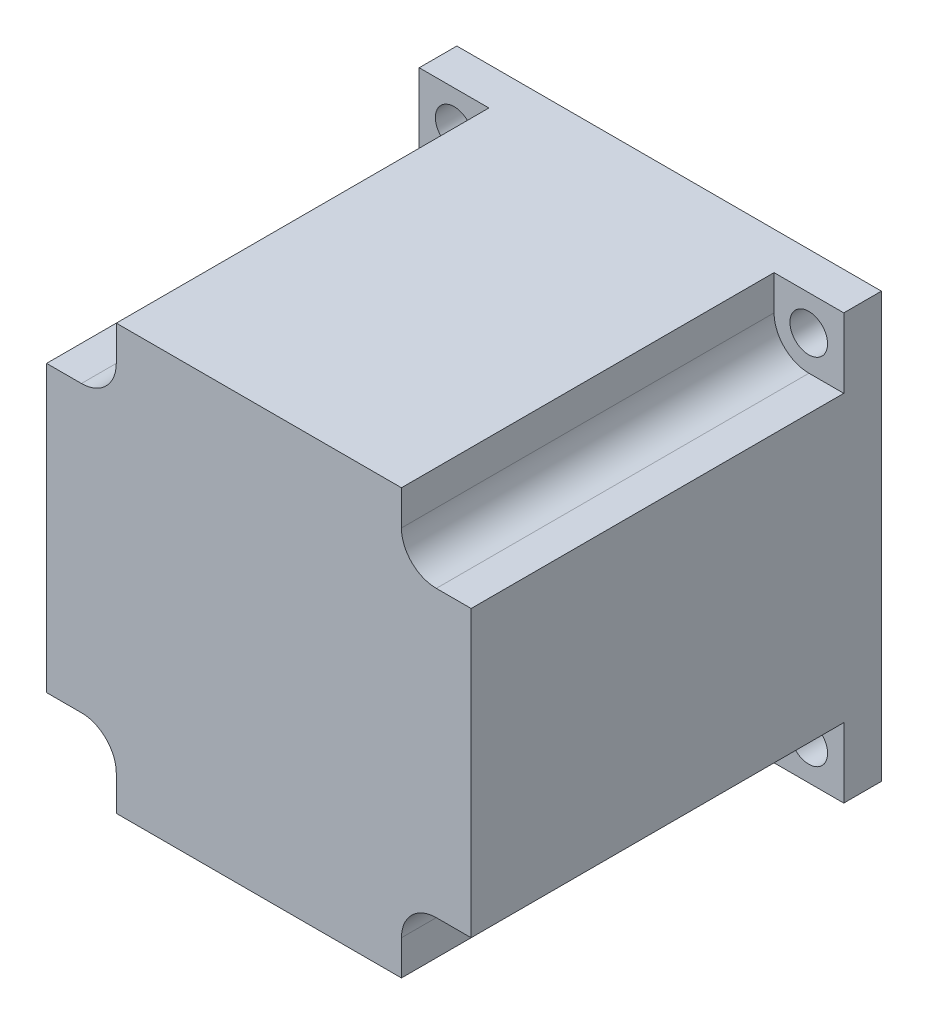
ISO-10303-21;
HEADER;
FILE_DESCRIPTION(('STEP AP214'),'2;1');
FILE_NAME('part.step','',(''),(''),'','','');
FILE_SCHEMA(('AUTOMOTIVE_DESIGN { 1 0 10303 214 1 1 1 1 }'));
ENDSEC;
DATA;
#1=APPLICATION_CONTEXT('core data for automotive mechanical design processes');
#2=APPLICATION_PROTOCOL_DEFINITION('international standard','automotive_design',2000,#1);
#3=PRODUCT_CONTEXT('',#1,'mechanical');
#4=PRODUCT('Part','Part','',(#3));
#5=PRODUCT_RELATED_PRODUCT_CATEGORY('part','',(#4));
#6=PRODUCT_DEFINITION_FORMATION('','',#4);
#7=PRODUCT_DEFINITION_CONTEXT('part definition',#1,'design');
#8=PRODUCT_DEFINITION('design','',#6,#7);
#9=PRODUCT_DEFINITION_SHAPE('','',#8);
#10=(LENGTH_UNIT() NAMED_UNIT(*) SI_UNIT(.MILLI.,.METRE.));
#11=(NAMED_UNIT(*) PLANE_ANGLE_UNIT() SI_UNIT($,.RADIAN.));
#12=(NAMED_UNIT(*) SI_UNIT($,.STERADIAN.) SOLID_ANGLE_UNIT());
#13=UNCERTAINTY_MEASURE_WITH_UNIT(LENGTH_MEASURE(1.E-05),#10,'distance_accuracy_value','');
#14=(GEOMETRIC_REPRESENTATION_CONTEXT(3) GLOBAL_UNCERTAINTY_ASSIGNED_CONTEXT((#13)) GLOBAL_UNIT_ASSIGNED_CONTEXT((#10,
#11,#12)) REPRESENTATION_CONTEXT('',''));
#15=CARTESIAN_POINT('',(0.,0.,0.));
#16=DIRECTION('',(0.,0.,1.));
#17=DIRECTION('',(1.,0.,0.));
#18=AXIS2_PLACEMENT_3D('',#15,#16,#17);
#19=CARTESIAN_POINT('',(23.55,-23.55,54.5));
#20=DIRECTION('',(0.,0.,-1.));
#21=DIRECTION('',(-1.,0.,0.));
#22=AXIS2_PLACEMENT_3D('',#19,#20,#21);
#23=CYLINDRICAL_SURFACE('',#22,2.5);
#24=CARTESIAN_POINT('',(23.55,-23.55,0.));
#25=DIRECTION('',(0.,0.,1.));
#26=DIRECTION('',(1.,0.,0.));
#27=AXIS2_PLACEMENT_3D('',#24,#25,#26);
#28=CIRCLE('',#27,2.5);
#29=CARTESIAN_POINT('',(26.05,-23.55,0.));
#30=VERTEX_POINT('',#29);
#31=EDGE_CURVE('E345',#30,#30,#28,.T.);
#32=ORIENTED_EDGE('',*,*,#31,.F.);
#33=EDGE_LOOP('',(#32));
#34=FACE_BOUND('',#33,.T.);
#35=CARTESIAN_POINT('',(23.55,-23.55,5.));
#36=DIRECTION('',(0.,0.,1.));
#37=DIRECTION('',(1.,0.,0.));
#38=AXIS2_PLACEMENT_3D('',#35,#36,#37);
#39=CIRCLE('',#38,2.5);
#40=CARTESIAN_POINT('',(26.05,-23.55,5.));
#41=VERTEX_POINT('',#40);
#42=EDGE_CURVE('E39',#41,#41,#39,.T.);
#43=ORIENTED_EDGE('',*,*,#42,.T.);
#44=EDGE_LOOP('',(#43));
#45=FACE_BOUND('',#44,.T.);
#46=ADVANCED_FACE('F35',(#34,#45),#23,.F.);
#47=CARTESIAN_POINT('',(-23.55,-23.55,54.5));
#48=DIRECTION('',(0.,0.,-1.));
#49=DIRECTION('',(-1.,0.,0.));
#50=AXIS2_PLACEMENT_3D('',#47,#48,#49);
#51=CYLINDRICAL_SURFACE('',#50,2.5);
#52=CARTESIAN_POINT('',(-23.55,-23.55,0.));
#53=DIRECTION('',(0.,0.,1.));
#54=DIRECTION('',(1.,0.,0.));
#55=AXIS2_PLACEMENT_3D('',#52,#53,#54);
#56=CIRCLE('',#55,2.5);
#57=CARTESIAN_POINT('',(-21.05,-23.55,0.));
#58=VERTEX_POINT('',#57);
#59=EDGE_CURVE('E342',#58,#58,#56,.T.);
#60=ORIENTED_EDGE('',*,*,#59,.F.);
#61=EDGE_LOOP('',(#60));
#62=FACE_BOUND('',#61,.T.);
#63=CARTESIAN_POINT('',(-23.55,-23.55,5.));
#64=DIRECTION('',(0.,0.,1.));
#65=DIRECTION('',(1.,0.,0.));
#66=AXIS2_PLACEMENT_3D('',#63,#64,#65);
#67=CIRCLE('',#66,2.5);
#68=CARTESIAN_POINT('',(-21.05,-23.55,5.));
#69=VERTEX_POINT('',#68);
#70=EDGE_CURVE('E383',#69,#69,#67,.T.);
#71=ORIENTED_EDGE('',*,*,#70,.T.);
#72=EDGE_LOOP('',(#71));
#73=FACE_BOUND('',#72,.T.);
#74=ADVANCED_FACE('F400',(#62,#73),#51,.F.);
#75=CARTESIAN_POINT('',(23.55,23.55,54.5));
#76=DIRECTION('',(0.,0.,-1.));
#77=DIRECTION('',(-1.,0.,0.));
#78=AXIS2_PLACEMENT_3D('',#75,#76,#77);
#79=CYLINDRICAL_SURFACE('',#78,2.5);
#80=CARTESIAN_POINT('',(23.55,23.55,0.));
#81=DIRECTION('',(0.,0.,1.));
#82=DIRECTION('',(1.,0.,0.));
#83=AXIS2_PLACEMENT_3D('',#80,#81,#82);
#84=CIRCLE('',#83,2.5);
#85=CARTESIAN_POINT('',(26.05,23.55,0.));
#86=VERTEX_POINT('',#85);
#87=EDGE_CURVE('E339',#86,#86,#84,.T.);
#88=ORIENTED_EDGE('',*,*,#87,.F.);
#89=EDGE_LOOP('',(#88));
#90=FACE_BOUND('',#89,.T.);
#91=CARTESIAN_POINT('',(23.55,23.55,5.));
#92=DIRECTION('',(0.,0.,1.));
#93=DIRECTION('',(1.,0.,0.));
#94=AXIS2_PLACEMENT_3D('',#91,#92,#93);
#95=CIRCLE('',#94,2.5);
#96=CARTESIAN_POINT('',(26.05,23.55,5.));
#97=VERTEX_POINT('',#96);
#98=EDGE_CURVE('E381',#97,#97,#95,.T.);
#99=ORIENTED_EDGE('',*,*,#98,.T.);
#100=EDGE_LOOP('',(#99));
#101=FACE_BOUND('',#100,.T.);
#102=ADVANCED_FACE('F406',(#90,#101),#79,.F.);
#103=CARTESIAN_POINT('',(-23.55,23.55,54.5));
#104=DIRECTION('',(0.,0.,-1.));
#105=DIRECTION('',(-1.,0.,0.));
#106=AXIS2_PLACEMENT_3D('',#103,#104,#105);
#107=CYLINDRICAL_SURFACE('',#106,2.5);
#108=CARTESIAN_POINT('',(-23.55,23.55,0.));
#109=DIRECTION('',(0.,0.,1.));
#110=DIRECTION('',(1.,0.,0.));
#111=AXIS2_PLACEMENT_3D('',#108,#109,#110);
#112=CIRCLE('',#111,2.5);
#113=CARTESIAN_POINT('',(-21.05,23.55,0.));
#114=VERTEX_POINT('',#113);
#115=EDGE_CURVE('E336',#114,#114,#112,.T.);
#116=ORIENTED_EDGE('',*,*,#115,.F.);
#117=EDGE_LOOP('',(#116));
#118=FACE_BOUND('',#117,.T.);
#119=CARTESIAN_POINT('',(-23.55,23.55,5.));
#120=DIRECTION('',(0.,0.,1.));
#121=DIRECTION('',(1.,0.,0.));
#122=AXIS2_PLACEMENT_3D('',#119,#120,#121);
#123=CIRCLE('',#122,2.5);
#124=CARTESIAN_POINT('',(-21.05,23.55,5.));
#125=VERTEX_POINT('',#124);
#126=EDGE_CURVE('E307',#125,#125,#123,.T.);
#127=ORIENTED_EDGE('',*,*,#126,.T.);
#128=EDGE_LOOP('',(#127));
#129=FACE_BOUND('',#128,.T.);
#130=ADVANCED_FACE('F416',(#118,#129),#107,.F.);
#131=CARTESIAN_POINT('',(0.,0.,54.5));
#132=DIRECTION('',(0.,0.,-1.));
#133=DIRECTION('',(-1.,0.,0.));
#134=AXIS2_PLACEMENT_3D('',#131,#132,#133);
#135=PLANE('',#134);
#136=CARTESIAN_POINT('',(-23.5699999999994,23.569999999994,54.5));
#137=DIRECTION('',(0.,0.,1.));
#138=DIRECTION('',(1.,0.,0.));
#139=AXIS2_PLACEMENT_3D('',#136,#137,#138);
#140=CIRCLE('',#139,4.62999999999667);
#141=CARTESIAN_POINT('',(-23.5699999999998,18.9400000000002,54.5));
#142=VERTEX_POINT('',#141);
#143=CARTESIAN_POINT('',(-18.9399999999998,23.5700000000002,54.5));
#144=VERTEX_POINT('',#143);
#145=EDGE_CURVE('E272',#142,#144,#140,.T.);
#146=ORIENTED_EDGE('',*,*,#145,.F.);
#147=DIRECTION('',(1.,0.,0.));
#148=VECTOR('',#147,1.);
#149=CARTESIAN_POINT('',(-23.5699999999998,18.9400000000002,54.5));
#150=LINE('',#149,#148);
#151=CARTESIAN_POINT('',(-28.1999999999998,18.9400000000003,54.5));
#152=VERTEX_POINT('',#151);
#153=EDGE_CURVE('E263',#152,#142,#150,.T.);
#154=ORIENTED_EDGE('',*,*,#153,.F.);
#155=DIRECTION('',(0.,-1.,0.));
#156=VECTOR('',#155,1.);
#157=CARTESIAN_POINT('',(-28.2,-28.2,54.5));
#158=LINE('',#157,#156);
#159=CARTESIAN_POINT('',(-28.1999999999933,-18.9400000000058,54.5));
#160=VERTEX_POINT('',#159);
#161=EDGE_CURVE('E356',#152,#160,#158,.T.);
#162=ORIENTED_EDGE('',*,*,#161,.T.);
#163=DIRECTION('',(-1.,-1.28137241638215E-12,0.));
#164=VECTOR('',#163,1.);
#165=CARTESIAN_POINT('',(-23.5700000000001,-18.9399999999998,54.5));
#166=LINE('',#165,#164);
#167=CARTESIAN_POINT('',(-23.5700000000001,-18.9399999999998,54.5));
#168=VERTEX_POINT('',#167);
#169=EDGE_CURVE('E247',#168,#160,#166,.T.);
#170=ORIENTED_EDGE('',*,*,#169,.F.);
#171=CARTESIAN_POINT('',(-23.5700000000002,-23.5699999999999,54.5));
#172=DIRECTION('',(0.,0.,1.));
#173=DIRECTION('',(1.,0.,0.));
#174=AXIS2_PLACEMENT_3D('',#171,#172,#173);
#175=CIRCLE('',#174,4.63000000000001);
#176=CARTESIAN_POINT('',(-18.9400000000001,-23.5699999999999,54.5));
#177=VERTEX_POINT('',#176);
#178=EDGE_CURVE('E244',#177,#168,#175,.T.);
#179=ORIENTED_EDGE('',*,*,#178,.F.);
#180=DIRECTION('',(-1.19894495099767E-13,1.,0.));
#181=VECTOR('',#180,1.);
#182=CARTESIAN_POINT('',(-18.9400000000001,-23.5699999999999,54.5));
#183=LINE('',#182,#181);
#184=CARTESIAN_POINT('',(-18.9399999999996,-28.2000000000054,54.5));
#185=VERTEX_POINT('',#184);
#186=EDGE_CURVE('E233',#185,#177,#183,.T.);
#187=ORIENTED_EDGE('',*,*,#186,.F.);
#188=DIRECTION('',(1.,0.,0.));
#189=VECTOR('',#188,1.);
#190=CARTESIAN_POINT('',(-28.2,-28.2,54.5));
#191=LINE('',#190,#189);
#192=CARTESIAN_POINT('',(18.9400000000064,-28.1999999999994,54.5));
#193=VERTEX_POINT('',#192);
#194=EDGE_CURVE('E359',#185,#193,#191,.T.);
#195=ORIENTED_EDGE('',*,*,#194,.T.);
#196=DIRECTION('',(0.,-1.,0.));
#197=VECTOR('',#196,1.);
#198=CARTESIAN_POINT('',(18.940000000006,-23.5699999999993,54.5));
#199=LINE('',#198,#197);
#200=CARTESIAN_POINT('',(18.940000000006,-23.5699999999993,54.5));
#201=VERTEX_POINT('',#200);
#202=EDGE_CURVE('E213',#201,#193,#199,.T.);
#203=ORIENTED_EDGE('',*,*,#202,.F.);
#204=CARTESIAN_POINT('',(23.570000000006,-23.5699999999993,54.5));
#205=DIRECTION('',(0.,0.,1.));
#206=DIRECTION('',(1.,0.,0.));
#207=AXIS2_PLACEMENT_3D('',#204,#205,#206);
#208=CIRCLE('',#207,4.63000000000001);
#209=CARTESIAN_POINT('',(23.570000000006,-18.9399999999993,54.5));
#210=VERTEX_POINT('',#209);
#211=EDGE_CURVE('E194',#210,#201,#208,.T.);
#212=ORIENTED_EDGE('',*,*,#211,.F.);
#213=DIRECTION('',(-1.,1.35480779462898E-12,0.));
#214=VECTOR('',#213,1.);
#215=CARTESIAN_POINT('',(23.570000000006,-18.9399999999993,54.5));
#216=LINE('',#215,#214);
#217=CARTESIAN_POINT('',(28.200000000006,-18.9400000000056,54.5));
#218=VERTEX_POINT('',#217);
#219=EDGE_CURVE('E210',#218,#210,#216,.T.);
#220=ORIENTED_EDGE('',*,*,#219,.F.);
#221=DIRECTION('',(0.,1.,0.));
#222=VECTOR('',#221,1.);
#223=CARTESIAN_POINT('',(28.2,-28.2,54.5));
#224=LINE('',#223,#222);
#225=CARTESIAN_POINT('',(28.2,18.94,54.5));
#226=VERTEX_POINT('',#225);
#227=EDGE_CURVE('E349',#218,#226,#224,.T.);
#228=ORIENTED_EDGE('',*,*,#227,.T.);
#229=DIRECTION('',(1.,0.,0.));
#230=VECTOR('',#229,1.);
#231=CARTESIAN_POINT('',(23.57,18.94,54.5));
#232=LINE('',#231,#230);
#233=CARTESIAN_POINT('',(23.57,18.94,54.5));
#234=VERTEX_POINT('',#233);
#235=EDGE_CURVE('E301',#234,#226,#232,.T.);
#236=ORIENTED_EDGE('',*,*,#235,.F.);
#237=CARTESIAN_POINT('',(23.57,23.57,54.5));
#238=DIRECTION('',(0.,0.,1.));
#239=DIRECTION('',(1.,0.,0.));
#240=AXIS2_PLACEMENT_3D('',#237,#238,#239);
#241=CIRCLE('',#240,4.63000000000001);
#242=CARTESIAN_POINT('',(18.94,23.57,54.5));
#243=VERTEX_POINT('',#242);
#244=EDGE_CURVE('E225',#243,#234,#241,.T.);
#245=ORIENTED_EDGE('',*,*,#244,.F.);
#246=DIRECTION('',(-1.35480779462898E-12,-1.,0.));
#247=VECTOR('',#246,1.);
#248=CARTESIAN_POINT('',(18.94,23.57,54.5));
#249=LINE('',#248,#247);
#250=CARTESIAN_POINT('',(18.9400000000063,28.2,54.5));
#251=VERTEX_POINT('',#250);
#252=EDGE_CURVE('E290',#251,#243,#249,.T.);
#253=ORIENTED_EDGE('',*,*,#252,.F.);
#254=DIRECTION('',(-1.,0.,0.));
#255=VECTOR('',#254,1.);
#256=CARTESIAN_POINT('',(-28.2,28.2,54.5));
#257=LINE('',#256,#255);
#258=CARTESIAN_POINT('',(-18.9399999999998,28.199999999994,54.5));
#259=VERTEX_POINT('',#258);
#260=EDGE_CURVE('E352',#251,#259,#257,.T.);
#261=ORIENTED_EDGE('',*,*,#260,.T.);
#262=DIRECTION('',(0.,1.,0.));
#263=VECTOR('',#262,1.);
#264=CARTESIAN_POINT('',(-18.9399999999998,23.5700000000002,54.5));
#265=LINE('',#264,#263);
#266=EDGE_CURVE('E275',#144,#259,#265,.T.);
#267=ORIENTED_EDGE('',*,*,#266,.F.);
#268=EDGE_LOOP('',(#146,#154,#162,#170,#179,#187,#195,#203,#212,#220,#228,#236,#245,#253,#261,#267));
#269=FACE_BOUND('',#268,.T.);
#270=ADVANCED_FACE('F412',(#269),#135,.F.);
#271=CARTESIAN_POINT('',(0.,0.,0.));
#272=DIRECTION('',(0.,0.,-1.));
#273=DIRECTION('',(-1.,0.,0.));
#274=AXIS2_PLACEMENT_3D('',#271,#272,#273);
#275=PLANE('',#274);
#276=CARTESIAN_POINT('',(0.,0.,0.));
#277=DIRECTION('',(0.,0.,-1.));
#278=DIRECTION('',(-1.,0.,0.));
#279=AXIS2_PLACEMENT_3D('',#276,#277,#278);
#280=CIRCLE('',#279,19.05);
#281=CARTESIAN_POINT('',(-19.05,0.,0.));
#282=VERTEX_POINT('',#281);
#283=EDGE_CURVE('E318',#282,#282,#280,.T.);
#284=ORIENTED_EDGE('',*,*,#283,.F.);
#285=EDGE_LOOP('',(#284));
#286=FACE_BOUND('',#285,.T.);
#287=ORIENTED_EDGE('',*,*,#87,.T.);
#288=EDGE_LOOP('',(#287));
#289=FACE_BOUND('',#288,.T.);
#290=ORIENTED_EDGE('',*,*,#31,.T.);
#291=EDGE_LOOP('',(#290));
#292=FACE_BOUND('',#291,.T.);
#293=DIRECTION('',(0.,1.,0.));
#294=VECTOR('',#293,1.);
#295=CARTESIAN_POINT('',(28.2,-28.2,0.));
#296=LINE('',#295,#294);
#297=CARTESIAN_POINT('',(28.2,-28.2,0.));
#298=VERTEX_POINT('',#297);
#299=CARTESIAN_POINT('',(28.2,28.2,0.));
#300=VERTEX_POINT('',#299);
#301=EDGE_CURVE('E348',#298,#300,#296,.T.);
#302=ORIENTED_EDGE('',*,*,#301,.F.);
#303=DIRECTION('',(1.,0.,0.));
#304=VECTOR('',#303,1.);
#305=CARTESIAN_POINT('',(-28.2,-28.2,0.));
#306=LINE('',#305,#304);
#307=CARTESIAN_POINT('',(-28.2,-28.2,0.));
#308=VERTEX_POINT('',#307);
#309=EDGE_CURVE('E353',#308,#298,#306,.T.);
#310=ORIENTED_EDGE('',*,*,#309,.F.);
#311=DIRECTION('',(0.,-1.,0.));
#312=VECTOR('',#311,1.);
#313=CARTESIAN_POINT('',(-28.2,-28.2,0.));
#314=LINE('',#313,#312);
#315=CARTESIAN_POINT('',(-28.2,28.2,0.));
#316=VERTEX_POINT('',#315);
#317=EDGE_CURVE('E368',#316,#308,#314,.T.);
#318=ORIENTED_EDGE('',*,*,#317,.F.);
#319=DIRECTION('',(-1.,0.,0.));
#320=VECTOR('',#319,1.);
#321=CARTESIAN_POINT('',(-28.2,28.2,0.));
#322=LINE('',#321,#320);
#323=EDGE_CURVE('E365',#300,#316,#322,.T.);
#324=ORIENTED_EDGE('',*,*,#323,.F.);
#325=EDGE_LOOP('',(#302,#310,#318,#324));
#326=FACE_BOUND('',#325,.T.);
#327=ORIENTED_EDGE('',*,*,#59,.T.);
#328=EDGE_LOOP('',(#327));
#329=FACE_BOUND('',#328,.T.);
#330=ORIENTED_EDGE('',*,*,#115,.T.);
#331=EDGE_LOOP('',(#330));
#332=FACE_BOUND('',#331,.T.);
#333=ADVANCED_FACE('F415',(#286,#289,#292,#326,#329,#332),#275,.T.);
#334=CARTESIAN_POINT('',(28.2,-28.2,54.5));
#335=DIRECTION('',(-1.,0.,0.));
#336=DIRECTION('',(0.,0.,1.));
#337=AXIS2_PLACEMENT_3D('',#334,#335,#336);
#338=PLANE('',#337);
#339=ORIENTED_EDGE('',*,*,#227,.F.);
#340=DIRECTION('',(0.,0.,1.));
#341=VECTOR('',#340,1.);
#342=CARTESIAN_POINT('',(28.200000000006,-18.9400000000056,5.));
#343=LINE('',#342,#341);
#344=CARTESIAN_POINT('',(28.200000000006,-18.9400000000056,5.));
#345=VERTEX_POINT('',#344);
#346=EDGE_CURVE('E226',#345,#218,#343,.T.);
#347=ORIENTED_EDGE('',*,*,#346,.F.);
#348=DIRECTION('',(0.,1.,0.));
#349=VECTOR('',#348,1.);
#350=CARTESIAN_POINT('',(28.200000000006,-18.9400000000056,5.));
#351=LINE('',#350,#349);
#352=CARTESIAN_POINT('',(28.200000000006,-28.1999999999993,5.));
#353=VERTEX_POINT('',#352);
#354=EDGE_CURVE('E217',#353,#345,#351,.T.);
#355=ORIENTED_EDGE('',*,*,#354,.F.);
#356=DIRECTION('',(0.,0.,-1.));
#357=VECTOR('',#356,1.);
#358=CARTESIAN_POINT('',(28.2,-28.2,54.5));
#359=LINE('',#358,#357);
#360=EDGE_CURVE('E362',#353,#298,#359,.T.);
#361=ORIENTED_EDGE('',*,*,#360,.T.);
#362=ORIENTED_EDGE('',*,*,#301,.T.);
#363=DIRECTION('',(0.,0.,-1.));
#364=VECTOR('',#363,1.);
#365=CARTESIAN_POINT('',(28.2,28.2,54.5));
#366=LINE('',#365,#364);
#367=CARTESIAN_POINT('',(28.2,28.2,5.));
#368=VERTEX_POINT('',#367);
#369=EDGE_CURVE('E11',#368,#300,#366,.T.);
#370=ORIENTED_EDGE('',*,*,#369,.F.);
#371=DIRECTION('',(0.,1.,0.));
#372=VECTOR('',#371,1.);
#373=CARTESIAN_POINT('',(28.2,28.2,5.));
#374=LINE('',#373,#372);
#375=CARTESIAN_POINT('',(28.2,18.94,5.));
#376=VERTEX_POINT('',#375);
#377=EDGE_CURVE('E52',#376,#368,#374,.T.);
#378=ORIENTED_EDGE('',*,*,#377,.F.);
#379=DIRECTION('',(0.,0.,1.));
#380=VECTOR('',#379,1.);
#381=CARTESIAN_POINT('',(28.2,18.94,5.));
#382=LINE('',#381,#380);
#383=EDGE_CURVE('E310',#376,#226,#382,.T.);
#384=ORIENTED_EDGE('',*,*,#383,.T.);
#385=EDGE_LOOP('',(#339,#347,#355,#361,#362,#370,#378,#384));
#386=FACE_BOUND('',#385,.T.);
#387=ADVANCED_FACE('F37',(#386),#338,.F.);
#388=CARTESIAN_POINT('',(-28.2,28.2,54.5));
#389=DIRECTION('',(0.,-1.,0.));
#390=DIRECTION('',(0.,0.,-1.));
#391=AXIS2_PLACEMENT_3D('',#388,#389,#390);
#392=PLANE('',#391);
#393=DIRECTION('',(-1.,0.,0.));
#394=VECTOR('',#393,1.);
#395=CARTESIAN_POINT('',(-28.1999999999993,28.199999999994,5.));
#396=LINE('',#395,#394);
#397=CARTESIAN_POINT('',(-18.9399999999998,28.199999999994,5.));
#398=VERTEX_POINT('',#397);
#399=CARTESIAN_POINT('',(-28.2,28.2,5.));
#400=VERTEX_POINT('',#399);
#401=EDGE_CURVE('E60',#398,#400,#396,.T.);
#402=ORIENTED_EDGE('',*,*,#401,.F.);
#403=DIRECTION('',(0.,0.,1.));
#404=VECTOR('',#403,1.);
#405=CARTESIAN_POINT('',(-18.9399999999998,28.199999999994,5.));
#406=LINE('',#405,#404);
#407=EDGE_CURVE('E282',#398,#259,#406,.T.);
#408=ORIENTED_EDGE('',*,*,#407,.T.);
#409=ORIENTED_EDGE('',*,*,#260,.F.);
#410=DIRECTION('',(0.,0.,1.));
#411=VECTOR('',#410,1.);
#412=CARTESIAN_POINT('',(18.9400000000063,28.2,5.));
#413=LINE('',#412,#411);
#414=CARTESIAN_POINT('',(18.9400000000063,28.2,5.));
#415=VERTEX_POINT('',#414);
#416=EDGE_CURVE('E308',#415,#251,#413,.T.);
#417=ORIENTED_EDGE('',*,*,#416,.F.);
#418=DIRECTION('',(-1.,0.,0.));
#419=VECTOR('',#418,1.);
#420=CARTESIAN_POINT('',(18.9400000000063,28.2,5.));
#421=LINE('',#420,#419);
#422=EDGE_CURVE('E293',#368,#415,#421,.T.);
#423=ORIENTED_EDGE('',*,*,#422,.F.);
#424=ORIENTED_EDGE('',*,*,#369,.T.);
#425=ORIENTED_EDGE('',*,*,#323,.T.);
#426=DIRECTION('',(0.,0.,-1.));
#427=VECTOR('',#426,1.);
#428=CARTESIAN_POINT('',(-28.2,28.2,54.5));
#429=LINE('',#428,#427);
#430=EDGE_CURVE('E44',#400,#316,#429,.T.);
#431=ORIENTED_EDGE('',*,*,#430,.F.);
#432=EDGE_LOOP('',(#402,#408,#409,#417,#423,#424,#425,#431));
#433=FACE_BOUND('',#432,.T.);
#434=ADVANCED_FACE('F428',(#433),#392,.F.);
#435=CARTESIAN_POINT('',(-28.2,-28.2,54.5));
#436=DIRECTION('',(1.,0.,0.));
#437=DIRECTION('',(0.,0.,-1.));
#438=AXIS2_PLACEMENT_3D('',#435,#436,#437);
#439=PLANE('',#438);
#440=ORIENTED_EDGE('',*,*,#161,.F.);
#441=DIRECTION('',(0.,0.,1.));
#442=VECTOR('',#441,1.);
#443=CARTESIAN_POINT('',(-28.1999999999998,18.9400000000003,5.));
#444=LINE('',#443,#442);
#445=CARTESIAN_POINT('',(-28.1999999999998,18.9400000000003,5.));
#446=VERTEX_POINT('',#445);
#447=EDGE_CURVE('E280',#446,#152,#444,.T.);
#448=ORIENTED_EDGE('',*,*,#447,.F.);
#449=DIRECTION('',(0.,-1.,0.));
#450=VECTOR('',#449,1.);
#451=CARTESIAN_POINT('',(-28.1999999999998,18.9400000000003,5.));
#452=LINE('',#451,#450);
#453=EDGE_CURVE('E266',#400,#446,#452,.T.);
#454=ORIENTED_EDGE('',*,*,#453,.F.);
#455=ORIENTED_EDGE('',*,*,#430,.T.);
#456=ORIENTED_EDGE('',*,*,#317,.T.);
#457=DIRECTION('',(0.,0.,-1.));
#458=VECTOR('',#457,1.);
#459=CARTESIAN_POINT('',(-28.2,-28.2,54.5));
#460=LINE('',#459,#458);
#461=CARTESIAN_POINT('',(-28.2,-28.2,5.));
#462=VERTEX_POINT('',#461);
#463=EDGE_CURVE('E374',#462,#308,#460,.T.);
#464=ORIENTED_EDGE('',*,*,#463,.F.);
#465=DIRECTION('',(0.,-1.,0.));
#466=VECTOR('',#465,1.);
#467=CARTESIAN_POINT('',(-28.1999999999933,-28.2000000000054,5.));
#468=LINE('',#467,#466);
#469=CARTESIAN_POINT('',(-28.1999999999933,-18.9400000000058,5.));
#470=VERTEX_POINT('',#469);
#471=EDGE_CURVE('E236',#470,#462,#468,.T.);
#472=ORIENTED_EDGE('',*,*,#471,.F.);
#473=DIRECTION('',(0.,0.,1.));
#474=VECTOR('',#473,1.);
#475=CARTESIAN_POINT('',(-28.1999999999933,-18.9400000000058,5.));
#476=LINE('',#475,#474);
#477=EDGE_CURVE('E255',#470,#160,#476,.T.);
#478=ORIENTED_EDGE('',*,*,#477,.T.);
#479=EDGE_LOOP('',(#440,#448,#454,#455,#456,#464,#472,#478));
#480=FACE_BOUND('',#479,.T.);
#481=ADVANCED_FACE('F425',(#480),#439,.F.);
#482=CARTESIAN_POINT('',(-28.2,-28.2,54.5));
#483=DIRECTION('',(0.,1.,0.));
#484=DIRECTION('',(0.,0.,1.));
#485=AXIS2_PLACEMENT_3D('',#482,#483,#484);
#486=PLANE('',#485);
#487=ORIENTED_EDGE('',*,*,#194,.F.);
#488=DIRECTION('',(0.,0.,1.));
#489=VECTOR('',#488,1.);
#490=CARTESIAN_POINT('',(-18.9399999999996,-28.2000000000054,5.));
#491=LINE('',#490,#489);
#492=CARTESIAN_POINT('',(-18.9399999999996,-28.2000000000054,5.));
#493=VERTEX_POINT('',#492);
#494=EDGE_CURVE('E253',#493,#185,#491,.T.);
#495=ORIENTED_EDGE('',*,*,#494,.F.);
#496=DIRECTION('',(1.,0.,0.));
#497=VECTOR('',#496,1.);
#498=CARTESIAN_POINT('',(-18.9399999999996,-28.2000000000054,5.));
#499=LINE('',#498,#497);
#500=EDGE_CURVE('E238',#462,#493,#499,.T.);
#501=ORIENTED_EDGE('',*,*,#500,.F.);
#502=ORIENTED_EDGE('',*,*,#463,.T.);
#503=ORIENTED_EDGE('',*,*,#309,.T.);
#504=ORIENTED_EDGE('',*,*,#360,.F.);
#505=DIRECTION('',(1.,0.,0.));
#506=VECTOR('',#505,1.);
#507=CARTESIAN_POINT('',(28.200000000006,-28.1999999999993,5.));
#508=LINE('',#507,#506);
#509=CARTESIAN_POINT('',(18.940000000006,-28.2,5.));
#510=VERTEX_POINT('',#509);
#511=EDGE_CURVE('E206',#510,#353,#508,.T.);
#512=ORIENTED_EDGE('',*,*,#511,.F.);
#513=DIRECTION('',(0.,0.,1.));
#514=VECTOR('',#513,1.);
#515=CARTESIAN_POINT('',(18.9400000000064,-28.1999999999994,5.));
#516=LINE('',#515,#514);
#517=EDGE_CURVE('E197',#510,#193,#516,.T.);
#518=ORIENTED_EDGE('',*,*,#517,.T.);
#519=EDGE_LOOP('',(#487,#495,#501,#502,#503,#504,#512,#518));
#520=FACE_BOUND('',#519,.T.);
#521=ADVANCED_FACE('F421',(#520),#486,.F.);
#522=CARTESIAN_POINT('',(0.,0.,-2.));
#523=DIRECTION('',(0.,0.,1.));
#524=DIRECTION('',(1.,0.,0.));
#525=AXIS2_PLACEMENT_3D('',#522,#523,#524);
#526=CYLINDRICAL_SURFACE('',#525,19.05);
#527=CARTESIAN_POINT('',(0.,0.,-2.));
#528=DIRECTION('',(0.,0.,-1.));
#529=DIRECTION('',(-1.,0.,0.));
#530=AXIS2_PLACEMENT_3D('',#527,#528,#529);
#531=CIRCLE('',#530,19.05);
#532=CARTESIAN_POINT('',(-19.05,0.,-2.));
#533=VERTEX_POINT('',#532);
#534=EDGE_CURVE('E314',#533,#533,#531,.T.);
#535=ORIENTED_EDGE('',*,*,#534,.F.);
#536=EDGE_LOOP('',(#535));
#537=FACE_BOUND('',#536,.T.);
#538=ORIENTED_EDGE('',*,*,#283,.T.);
#539=EDGE_LOOP('',(#538));
#540=FACE_BOUND('',#539,.T.);
#541=ADVANCED_FACE('F424',(#537,#540),#526,.T.);
#542=CARTESIAN_POINT('',(0.,0.,-2.));
#543=DIRECTION('',(0.,0.,-1.));
#544=DIRECTION('',(-1.,0.,0.));
#545=AXIS2_PLACEMENT_3D('',#542,#543,#544);
#546=PLANE('',#545);
#547=CARTESIAN_POINT('',(0.,0.,-2.));
#548=DIRECTION('',(0.,0.,-1.));
#549=DIRECTION('',(-1.,0.,0.));
#550=AXIS2_PLACEMENT_3D('',#547,#548,#549);
#551=CIRCLE('',#550,4.);
#552=CARTESIAN_POINT('',(-4.,0.,-2.));
#553=VERTEX_POINT('',#552);
#554=EDGE_CURVE('E317',#553,#553,#551,.T.);
#555=ORIENTED_EDGE('',*,*,#554,.F.);
#556=EDGE_LOOP('',(#555));
#557=FACE_BOUND('',#556,.T.);
#558=ORIENTED_EDGE('',*,*,#534,.T.);
#559=EDGE_LOOP('',(#558));
#560=FACE_BOUND('',#559,.T.);
#561=ADVANCED_FACE('F516',(#557,#560),#546,.T.);
#562=CARTESIAN_POINT('',(0.,0.,-4.));
#563=DIRECTION('',(0.,0.,-1.));
#564=DIRECTION('',(-1.,0.,0.));
#565=AXIS2_PLACEMENT_3D('',#562,#563,#564);
#566=PLANE('',#565);
#567=CARTESIAN_POINT('',(0.,0.,-4.));
#568=DIRECTION('',(0.,0.,-1.));
#569=DIRECTION('',(-1.,0.,0.));
#570=AXIS2_PLACEMENT_3D('',#567,#568,#569);
#571=CIRCLE('',#570,3.99999999999999);
#572=CARTESIAN_POINT('',(1.93649167310371,-3.5,-4.));
#573=VERTEX_POINT('',#572);
#574=CARTESIAN_POINT('',(-1.93649167310371,-3.5,-4.));
#575=VERTEX_POINT('',#574);
#576=EDGE_CURVE('E321',#573,#575,#571,.T.);
#577=ORIENTED_EDGE('',*,*,#576,.T.);
#578=DIRECTION('',(1.,0.,0.));
#579=VECTOR('',#578,1.);
#580=CARTESIAN_POINT('',(-1.93649167310371,-3.5,-4.));
#581=LINE('',#580,#579);
#582=EDGE_CURVE('E323',#575,#573,#581,.T.);
#583=ORIENTED_EDGE('',*,*,#582,.T.);
#584=EDGE_LOOP('',(#577,#583));
#585=FACE_BOUND('',#584,.T.);
#586=ADVANCED_FACE('F519',(#585),#566,.T.);
#587=CARTESIAN_POINT('',(-1.93649167310371,-3.5,-4.));
#588=DIRECTION('',(0.,1.,0.));
#589=DIRECTION('',(0.,0.,1.));
#590=AXIS2_PLACEMENT_3D('',#587,#588,#589);
#591=PLANE('',#590);
#592=DIRECTION('',(1.,0.,0.));
#593=VECTOR('',#592,1.);
#594=CARTESIAN_POINT('',(-1.93649167310371,-3.5,-22.));
#595=LINE('',#594,#593);
#596=CARTESIAN_POINT('',(-1.93649167310371,-3.5,-22.));
#597=VERTEX_POINT('',#596);
#598=CARTESIAN_POINT('',(1.93649167310371,-3.5,-22.));
#599=VERTEX_POINT('',#598);
#600=EDGE_CURVE('E324',#597,#599,#595,.T.);
#601=ORIENTED_EDGE('',*,*,#600,.T.);
#602=DIRECTION('',(0.,0.,-1.));
#603=VECTOR('',#602,1.);
#604=CARTESIAN_POINT('',(1.93649167310371,-3.5,-4.));
#605=LINE('',#604,#603);
#606=EDGE_CURVE('E329',#573,#599,#605,.T.);
#607=ORIENTED_EDGE('',*,*,#606,.F.);
#608=ORIENTED_EDGE('',*,*,#582,.F.);
#609=DIRECTION('',(0.,0.,-1.));
#610=VECTOR('',#609,1.);
#611=CARTESIAN_POINT('',(-1.93649167310371,-3.5,-4.));
#612=LINE('',#611,#610);
#613=EDGE_CURVE('E327',#575,#597,#612,.T.);
#614=ORIENTED_EDGE('',*,*,#613,.T.);
#615=EDGE_LOOP('',(#601,#607,#608,#614));
#616=FACE_BOUND('',#615,.T.);
#617=ADVANCED_FACE('F526',(#616),#591,.F.);
#618=CARTESIAN_POINT('',(0.,0.,-22.));
#619=DIRECTION('',(0.,0.,-1.));
#620=DIRECTION('',(-1.,0.,0.));
#621=AXIS2_PLACEMENT_3D('',#618,#619,#620);
#622=PLANE('',#621);
#623=ORIENTED_EDGE('',*,*,#600,.F.);
#624=CARTESIAN_POINT('',(0.,0.,-22.));
#625=DIRECTION('',(0.,0.,-1.));
#626=DIRECTION('',(-1.,0.,0.));
#627=AXIS2_PLACEMENT_3D('',#624,#625,#626);
#628=CIRCLE('',#627,4.);
#629=EDGE_CURVE('E332',#597,#599,#628,.T.);
#630=ORIENTED_EDGE('',*,*,#629,.T.);
#631=EDGE_LOOP('',(#623,#630));
#632=FACE_BOUND('',#631,.T.);
#633=ADVANCED_FACE('F530',(#632),#622,.T.);
#634=CARTESIAN_POINT('',(0.,0.,-22.));
#635=DIRECTION('',(0.,0.,1.));
#636=DIRECTION('',(1.,0.,0.));
#637=AXIS2_PLACEMENT_3D('',#634,#635,#636);
#638=CYLINDRICAL_SURFACE('',#637,4.);
#639=ORIENTED_EDGE('',*,*,#554,.T.);
#640=EDGE_LOOP('',(#639));
#641=FACE_BOUND('',#640,.T.);
#642=ORIENTED_EDGE('',*,*,#629,.F.);
#643=ORIENTED_EDGE('',*,*,#613,.F.);
#644=ORIENTED_EDGE('',*,*,#576,.F.);
#645=ORIENTED_EDGE('',*,*,#606,.T.);
#646=EDGE_LOOP('',(#642,#643,#644,#645));
#647=FACE_BOUND('',#646,.T.);
#648=ADVANCED_FACE('F508',(#641,#647),#638,.T.);
#649=CARTESIAN_POINT('',(-23.5699999999994,23.569999999994,5.));
#650=DIRECTION('',(0.,0.,1.));
#651=DIRECTION('',(1.,0.,0.));
#652=AXIS2_PLACEMENT_3D('',#649,#650,#651);
#653=CYLINDRICAL_SURFACE('',#652,4.62999999999667);
#654=ORIENTED_EDGE('',*,*,#145,.T.);
#655=DIRECTION('',(0.,0.,1.));
#656=VECTOR('',#655,1.);
#657=CARTESIAN_POINT('',(-18.9399999999998,23.5700000000002,5.));
#658=LINE('',#657,#656);
#659=CARTESIAN_POINT('',(-18.9399999999998,23.5700000000002,5.));
#660=VERTEX_POINT('',#659);
#661=EDGE_CURVE('E271',#660,#144,#658,.T.);
#662=ORIENTED_EDGE('',*,*,#661,.F.);
#663=CARTESIAN_POINT('',(-23.5699999999994,23.569999999994,5.));
#664=DIRECTION('',(0.,0.,1.));
#665=DIRECTION('',(1.,0.,0.));
#666=AXIS2_PLACEMENT_3D('',#663,#664,#665);
#667=CIRCLE('',#666,4.62999999999667);
#668=CARTESIAN_POINT('',(-23.5699999999998,18.9400000000002,5.));
#669=VERTEX_POINT('',#668);
#670=EDGE_CURVE('E259',#669,#660,#667,.T.);
#671=ORIENTED_EDGE('',*,*,#670,.F.);
#672=DIRECTION('',(0.,0.,1.));
#673=VECTOR('',#672,1.);
#674=CARTESIAN_POINT('',(-23.5699999999998,18.9400000000002,5.));
#675=LINE('',#674,#673);
#676=EDGE_CURVE('E248',#669,#142,#675,.T.);
#677=ORIENTED_EDGE('',*,*,#676,.T.);
#678=EDGE_LOOP('',(#654,#662,#671,#677));
#679=FACE_BOUND('',#678,.T.);
#680=ADVANCED_FACE('F452',(#679),#653,.F.);
#681=CARTESIAN_POINT('',(-23.5699999999998,18.9400000000002,5.));
#682=DIRECTION('',(0.,-1.,0.));
#683=DIRECTION('',(1.,0.,0.));
#684=AXIS2_PLACEMENT_3D('',#681,#682,#683);
#685=PLANE('',#684);
#686=ORIENTED_EDGE('',*,*,#153,.T.);
#687=ORIENTED_EDGE('',*,*,#676,.F.);
#688=DIRECTION('',(1.,0.,0.));
#689=VECTOR('',#688,1.);
#690=CARTESIAN_POINT('',(-23.5699999999998,18.9400000000002,5.));
#691=LINE('',#690,#689);
#692=EDGE_CURVE('E268',#446,#669,#691,.T.);
#693=ORIENTED_EDGE('',*,*,#692,.F.);
#694=ORIENTED_EDGE('',*,*,#447,.T.);
#695=EDGE_LOOP('',(#686,#687,#693,#694));
#696=FACE_BOUND('',#695,.T.);
#697=ADVANCED_FACE('F447',(#696),#685,.F.);
#698=CARTESIAN_POINT('',(-18.9399999999998,23.5700000000002,5.));
#699=DIRECTION('',(1.,0.,0.));
#700=DIRECTION('',(0.,0.,-1.));
#701=AXIS2_PLACEMENT_3D('',#698,#699,#700);
#702=PLANE('',#701);
#703=ORIENTED_EDGE('',*,*,#266,.T.);
#704=ORIENTED_EDGE('',*,*,#407,.F.);
#705=DIRECTION('',(0.,1.,0.));
#706=VECTOR('',#705,1.);
#707=CARTESIAN_POINT('',(-18.9399999999998,23.5700000000002,5.));
#708=LINE('',#707,#706);
#709=EDGE_CURVE('E262',#660,#398,#708,.T.);
#710=ORIENTED_EDGE('',*,*,#709,.F.);
#711=ORIENTED_EDGE('',*,*,#661,.T.);
#712=EDGE_LOOP('',(#703,#704,#710,#711));
#713=FACE_BOUND('',#712,.T.);
#714=ADVANCED_FACE('F455',(#713),#702,.F.);
#715=CARTESIAN_POINT('',(-23.5699999999994,23.569999999994,5.));
#716=DIRECTION('',(0.,0.,1.));
#717=DIRECTION('',(1.,0.,0.));
#718=AXIS2_PLACEMENT_3D('',#715,#716,#717);
#719=PLANE('',#718);
#720=ORIENTED_EDGE('',*,*,#126,.F.);
#721=EDGE_LOOP('',(#720));
#722=FACE_BOUND('',#721,.T.);
#723=ORIENTED_EDGE('',*,*,#670,.T.);
#724=ORIENTED_EDGE('',*,*,#709,.T.);
#725=ORIENTED_EDGE('',*,*,#401,.T.);
#726=ORIENTED_EDGE('',*,*,#453,.T.);
#727=ORIENTED_EDGE('',*,*,#692,.T.);
#728=EDGE_LOOP('',(#723,#724,#725,#726,#727));
#729=FACE_BOUND('',#728,.T.);
#730=ADVANCED_FACE('F445',(#722,#729),#719,.T.);
#731=CARTESIAN_POINT('',(23.57,23.57,5.));
#732=DIRECTION('',(0.,0.,1.));
#733=DIRECTION('',(1.,0.,0.));
#734=AXIS2_PLACEMENT_3D('',#731,#732,#733);
#735=CYLINDRICAL_SURFACE('',#734,4.63000000000001);
#736=ORIENTED_EDGE('',*,*,#244,.T.);
#737=DIRECTION('',(0.,0.,1.));
#738=VECTOR('',#737,1.);
#739=CARTESIAN_POINT('',(23.57,18.94,5.));
#740=LINE('',#739,#738);
#741=CARTESIAN_POINT('',(23.57,18.94,5.));
#742=VERTEX_POINT('',#741);
#743=EDGE_CURVE('E298',#742,#234,#740,.T.);
#744=ORIENTED_EDGE('',*,*,#743,.F.);
#745=CARTESIAN_POINT('',(23.57,23.57,5.));
#746=DIRECTION('',(0.,0.,1.));
#747=DIRECTION('',(1.,0.,0.));
#748=AXIS2_PLACEMENT_3D('',#745,#746,#747);
#749=CIRCLE('',#748,4.63000000000001);
#750=CARTESIAN_POINT('',(18.94,23.57,5.));
#751=VERTEX_POINT('',#750);
#752=EDGE_CURVE('E286',#751,#742,#749,.T.);
#753=ORIENTED_EDGE('',*,*,#752,.F.);
#754=DIRECTION('',(0.,0.,1.));
#755=VECTOR('',#754,1.);
#756=CARTESIAN_POINT('',(18.94,23.57,5.));
#757=LINE('',#756,#755);
#758=EDGE_CURVE('E305',#751,#243,#757,.T.);
#759=ORIENTED_EDGE('',*,*,#758,.T.);
#760=EDGE_LOOP('',(#736,#744,#753,#759));
#761=FACE_BOUND('',#760,.T.);
#762=ADVANCED_FACE('F468',(#761),#735,.F.);
#763=CARTESIAN_POINT('',(18.94,23.57,5.));
#764=DIRECTION('',(-1.,1.35480779462898E-12,0.));
#765=DIRECTION('',(-1.35480779462898E-12,-1.,0.));
#766=AXIS2_PLACEMENT_3D('',#763,#764,#765);
#767=PLANE('',#766);
#768=ORIENTED_EDGE('',*,*,#252,.T.);
#769=ORIENTED_EDGE('',*,*,#758,.F.);
#770=DIRECTION('',(-1.35480779462898E-12,-1.,0.));
#771=VECTOR('',#770,1.);
#772=CARTESIAN_POINT('',(18.94,23.57,5.));
#773=LINE('',#772,#771);
#774=EDGE_CURVE('E295',#415,#751,#773,.T.);
#775=ORIENTED_EDGE('',*,*,#774,.F.);
#776=ORIENTED_EDGE('',*,*,#416,.T.);
#777=EDGE_LOOP('',(#768,#769,#775,#776));
#778=FACE_BOUND('',#777,.T.);
#779=ADVANCED_FACE('F463',(#778),#767,.F.);
#780=CARTESIAN_POINT('',(23.57,18.94,5.));
#781=DIRECTION('',(0.,-1.,0.));
#782=DIRECTION('',(0.,0.,-1.));
#783=AXIS2_PLACEMENT_3D('',#780,#781,#782);
#784=PLANE('',#783);
#785=ORIENTED_EDGE('',*,*,#235,.T.);
#786=ORIENTED_EDGE('',*,*,#383,.F.);
#787=DIRECTION('',(1.,0.,0.));
#788=VECTOR('',#787,1.);
#789=CARTESIAN_POINT('',(23.57,18.94,5.));
#790=LINE('',#789,#788);
#791=EDGE_CURVE('E289',#742,#376,#790,.T.);
#792=ORIENTED_EDGE('',*,*,#791,.F.);
#793=ORIENTED_EDGE('',*,*,#743,.T.);
#794=EDGE_LOOP('',(#785,#786,#792,#793));
#795=FACE_BOUND('',#794,.T.);
#796=ADVANCED_FACE('F471',(#795),#784,.F.);
#797=CARTESIAN_POINT('',(23.57,23.57,5.));
#798=DIRECTION('',(0.,0.,1.));
#799=DIRECTION('',(1.,0.,0.));
#800=AXIS2_PLACEMENT_3D('',#797,#798,#799);
#801=PLANE('',#800);
#802=ORIENTED_EDGE('',*,*,#98,.F.);
#803=EDGE_LOOP('',(#802));
#804=FACE_BOUND('',#803,.T.);
#805=ORIENTED_EDGE('',*,*,#752,.T.);
#806=ORIENTED_EDGE('',*,*,#791,.T.);
#807=ORIENTED_EDGE('',*,*,#377,.T.);
#808=ORIENTED_EDGE('',*,*,#422,.T.);
#809=ORIENTED_EDGE('',*,*,#774,.T.);
#810=EDGE_LOOP('',(#805,#806,#807,#808,#809));
#811=FACE_BOUND('',#810,.T.);
#812=ADVANCED_FACE('F465',(#804,#811),#801,.T.);
#813=CARTESIAN_POINT('',(-23.5700000000002,-23.5699999999999,5.));
#814=DIRECTION('',(0.,0.,1.));
#815=DIRECTION('',(1.,0.,0.));
#816=AXIS2_PLACEMENT_3D('',#813,#814,#815);
#817=CYLINDRICAL_SURFACE('',#816,4.63000000000001);
#818=ORIENTED_EDGE('',*,*,#178,.T.);
#819=DIRECTION('',(0.,0.,1.));
#820=VECTOR('',#819,1.);
#821=CARTESIAN_POINT('',(-23.5700000000001,-18.9399999999998,5.));
#822=LINE('',#821,#820);
#823=CARTESIAN_POINT('',(-23.5700000000001,-18.9399999999998,5.));
#824=VERTEX_POINT('',#823);
#825=EDGE_CURVE('E243',#824,#168,#822,.T.);
#826=ORIENTED_EDGE('',*,*,#825,.F.);
#827=CARTESIAN_POINT('',(-23.5700000000002,-23.5699999999999,5.));
#828=DIRECTION('',(0.,0.,1.));
#829=DIRECTION('',(1.,0.,0.));
#830=AXIS2_PLACEMENT_3D('',#827,#828,#829);
#831=CIRCLE('',#830,4.63000000000001);
#832=CARTESIAN_POINT('',(-18.9400000000001,-23.5699999999999,5.));
#833=VERTEX_POINT('',#832);
#834=EDGE_CURVE('E229',#833,#824,#831,.T.);
#835=ORIENTED_EDGE('',*,*,#834,.F.);
#836=DIRECTION('',(0.,0.,1.));
#837=VECTOR('',#836,1.);
#838=CARTESIAN_POINT('',(-18.9400000000001,-23.5699999999999,5.));
#839=LINE('',#838,#837);
#840=EDGE_CURVE('E221',#833,#177,#839,.T.);
#841=ORIENTED_EDGE('',*,*,#840,.T.);
#842=EDGE_LOOP('',(#818,#826,#835,#841));
#843=FACE_BOUND('',#842,.T.);
#844=ADVANCED_FACE('F502',(#843),#817,.F.);
#845=CARTESIAN_POINT('',(-18.9400000000001,-23.5699999999999,5.));
#846=DIRECTION('',(1.,1.19894495099767E-13,0.));
#847=DIRECTION('',(-1.19894495099767E-13,1.,0.));
#848=AXIS2_PLACEMENT_3D('',#845,#846,#847);
#849=PLANE('',#848);
#850=ORIENTED_EDGE('',*,*,#186,.T.);
#851=ORIENTED_EDGE('',*,*,#840,.F.);
#852=DIRECTION('',(-1.19894495099767E-13,1.,0.));
#853=VECTOR('',#852,1.);
#854=CARTESIAN_POINT('',(-18.9400000000001,-23.5699999999999,5.));
#855=LINE('',#854,#853);
#856=EDGE_CURVE('E240',#493,#833,#855,.T.);
#857=ORIENTED_EDGE('',*,*,#856,.F.);
#858=ORIENTED_EDGE('',*,*,#494,.T.);
#859=EDGE_LOOP('',(#850,#851,#857,#858));
#860=FACE_BOUND('',#859,.T.);
#861=ADVANCED_FACE('F639',(#860),#849,.F.);
#862=CARTESIAN_POINT('',(-23.5700000000001,-18.9399999999998,5.));
#863=DIRECTION('',(-1.28137241638215E-12,1.,0.));
#864=DIRECTION('',(-1.,-1.28137241638215E-12,0.));
#865=AXIS2_PLACEMENT_3D('',#862,#863,#864);
#866=PLANE('',#865);
#867=ORIENTED_EDGE('',*,*,#169,.T.);
#868=ORIENTED_EDGE('',*,*,#477,.F.);
#869=DIRECTION('',(-1.,-1.28137241638215E-12,0.));
#870=VECTOR('',#869,1.);
#871=CARTESIAN_POINT('',(-23.5700000000001,-18.9399999999998,5.));
#872=LINE('',#871,#870);
#873=EDGE_CURVE('E232',#824,#470,#872,.T.);
#874=ORIENTED_EDGE('',*,*,#873,.F.);
#875=ORIENTED_EDGE('',*,*,#825,.T.);
#876=EDGE_LOOP('',(#867,#868,#874,#875));
#877=FACE_BOUND('',#876,.T.);
#878=ADVANCED_FACE('F648',(#877),#866,.F.);
#879=CARTESIAN_POINT('',(-23.5700000000002,-23.5699999999999,5.));
#880=DIRECTION('',(0.,0.,1.));
#881=DIRECTION('',(1.,0.,0.));
#882=AXIS2_PLACEMENT_3D('',#879,#880,#881);
#883=PLANE('',#882);
#884=ORIENTED_EDGE('',*,*,#70,.F.);
#885=EDGE_LOOP('',(#884));
#886=FACE_BOUND('',#885,.T.);
#887=ORIENTED_EDGE('',*,*,#834,.T.);
#888=ORIENTED_EDGE('',*,*,#873,.T.);
#889=ORIENTED_EDGE('',*,*,#471,.T.);
#890=ORIENTED_EDGE('',*,*,#500,.T.);
#891=ORIENTED_EDGE('',*,*,#856,.T.);
#892=EDGE_LOOP('',(#887,#888,#889,#890,#891));
#893=FACE_BOUND('',#892,.T.);
#894=ADVANCED_FACE('F658',(#886,#893),#883,.T.);
#895=CARTESIAN_POINT('',(23.570000000006,-23.5699999999993,5.));
#896=DIRECTION('',(0.,0.,1.));
#897=DIRECTION('',(1.,0.,0.));
#898=AXIS2_PLACEMENT_3D('',#895,#896,#897);
#899=CYLINDRICAL_SURFACE('',#898,4.63000000000001);
#900=ORIENTED_EDGE('',*,*,#211,.T.);
#901=DIRECTION('',(0.,0.,1.));
#902=VECTOR('',#901,1.);
#903=CARTESIAN_POINT('',(18.940000000006,-23.5699999999993,5.));
#904=LINE('',#903,#902);
#905=CARTESIAN_POINT('',(18.940000000006,-23.5699999999993,5.));
#906=VERTEX_POINT('',#905);
#907=EDGE_CURVE('E187',#906,#201,#904,.T.);
#908=ORIENTED_EDGE('',*,*,#907,.F.);
#909=CARTESIAN_POINT('',(23.570000000006,-23.5699999999993,5.));
#910=DIRECTION('',(0.,0.,1.));
#911=DIRECTION('',(1.,0.,0.));
#912=AXIS2_PLACEMENT_3D('',#909,#910,#911);
#913=CIRCLE('',#912,4.63000000000001);
#914=CARTESIAN_POINT('',(23.570000000006,-18.9399999999993,5.));
#915=VERTEX_POINT('',#914);
#916=EDGE_CURVE('E191',#915,#906,#913,.T.);
#917=ORIENTED_EDGE('',*,*,#916,.F.);
#918=DIRECTION('',(0.,0.,1.));
#919=VECTOR('',#918,1.);
#920=CARTESIAN_POINT('',(23.570000000006,-18.9399999999993,5.));
#921=LINE('',#920,#919);
#922=EDGE_CURVE('E223',#915,#210,#921,.T.);
#923=ORIENTED_EDGE('',*,*,#922,.T.);
#924=EDGE_LOOP('',(#900,#908,#917,#923));
#925=FACE_BOUND('',#924,.T.);
#926=ADVANCED_FACE('F189',(#925),#899,.F.);
#927=CARTESIAN_POINT('',(23.570000000006,-18.9399999999993,5.));
#928=DIRECTION('',(1.35480779462898E-12,1.,0.));
#929=DIRECTION('',(-1.,1.35480779462898E-12,0.));
#930=AXIS2_PLACEMENT_3D('',#927,#928,#929);
#931=PLANE('',#930);
#932=ORIENTED_EDGE('',*,*,#219,.T.);
#933=ORIENTED_EDGE('',*,*,#922,.F.);
#934=DIRECTION('',(-1.,1.35480779462898E-12,0.));
#935=VECTOR('',#934,1.);
#936=CARTESIAN_POINT('',(23.570000000006,-18.9399999999993,5.));
#937=LINE('',#936,#935);
#938=EDGE_CURVE('E198',#345,#915,#937,.T.);
#939=ORIENTED_EDGE('',*,*,#938,.F.);
#940=ORIENTED_EDGE('',*,*,#346,.T.);
#941=EDGE_LOOP('',(#932,#933,#939,#940));
#942=FACE_BOUND('',#941,.T.);
#943=ADVANCED_FACE('F396',(#942),#931,.F.);
#944=CARTESIAN_POINT('',(18.940000000006,-23.5699999999993,5.));
#945=DIRECTION('',(-1.,0.,0.));
#946=DIRECTION('',(0.,-1.,0.));
#947=AXIS2_PLACEMENT_3D('',#944,#945,#946);
#948=PLANE('',#947);
#949=ORIENTED_EDGE('',*,*,#202,.T.);
#950=ORIENTED_EDGE('',*,*,#517,.F.);
#951=DIRECTION('',(0.,-1.,0.));
#952=VECTOR('',#951,1.);
#953=CARTESIAN_POINT('',(18.940000000006,-23.5699999999993,5.));
#954=LINE('',#953,#952);
#955=EDGE_CURVE('E201',#906,#510,#954,.T.);
#956=ORIENTED_EDGE('',*,*,#955,.F.);
#957=ORIENTED_EDGE('',*,*,#907,.T.);
#958=EDGE_LOOP('',(#949,#950,#956,#957));
#959=FACE_BOUND('',#958,.T.);
#960=ADVANCED_FACE('F202',(#959),#948,.F.);
#961=CARTESIAN_POINT('',(23.570000000006,-23.5699999999993,5.));
#962=DIRECTION('',(0.,0.,1.));
#963=DIRECTION('',(1.,0.,0.));
#964=AXIS2_PLACEMENT_3D('',#961,#962,#963);
#965=PLANE('',#964);
#966=ORIENTED_EDGE('',*,*,#42,.F.);
#967=EDGE_LOOP('',(#966));
#968=FACE_BOUND('',#967,.T.);
#969=ORIENTED_EDGE('',*,*,#916,.T.);
#970=ORIENTED_EDGE('',*,*,#955,.T.);
#971=ORIENTED_EDGE('',*,*,#511,.T.);
#972=ORIENTED_EDGE('',*,*,#354,.T.);
#973=ORIENTED_EDGE('',*,*,#938,.T.);
#974=EDGE_LOOP('',(#969,#970,#971,#972,#973));
#975=FACE_BOUND('',#974,.T.);
#976=ADVANCED_FACE('F208',(#968,#975),#965,.T.);
#977=CLOSED_SHELL('',(#46,#74,#102,#130,#270,#333,#387,#434,#481,#521,#541,#561,#586,#617,#633,
#648,#680,#697,#714,#730,#762,#779,#796,#812,#844,#861,#878,#894,#926,#943,#960,#976));
#978=MANIFOLD_SOLID_BREP('B2',#977);
#979=ADVANCED_BREP_SHAPE_REPRESENTATION('',(#18,#978),#14);
#980=SHAPE_DEFINITION_REPRESENTATION(#9,#979);
ENDSEC;
END-ISO-10303-21;
